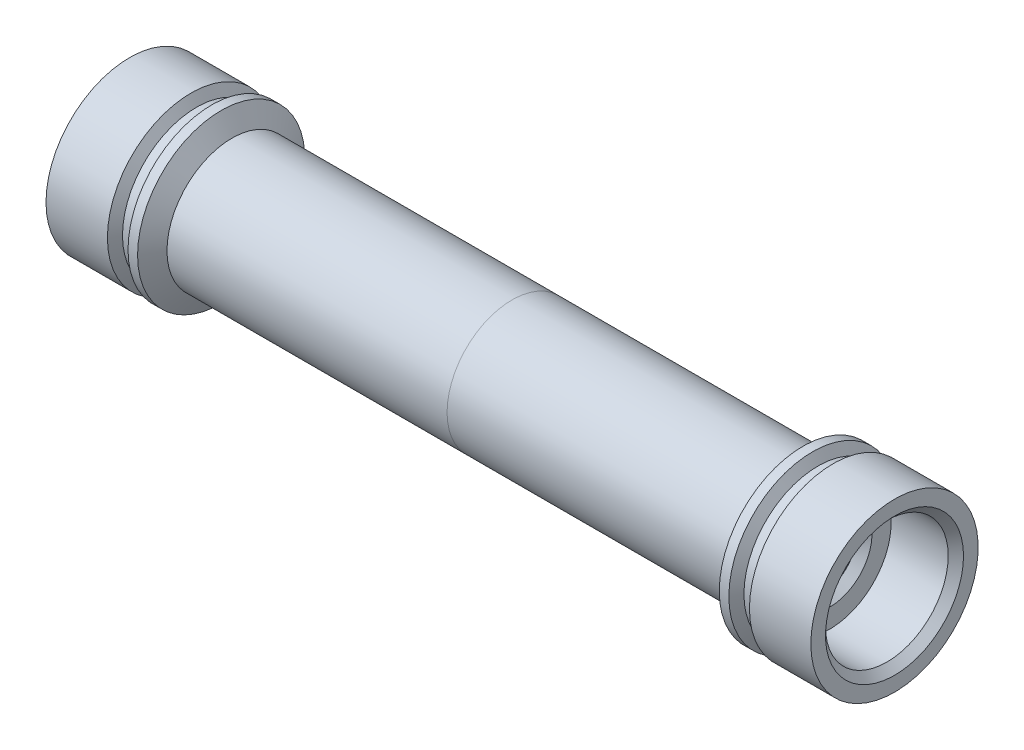
ISO-10303-21;
HEADER;
FILE_DESCRIPTION(('STEP AP214'),'2;1');
FILE_NAME('part.step','',(''),(''),'','','');
FILE_SCHEMA(('AUTOMOTIVE_DESIGN { 1 0 10303 214 1 1 1 1 }'));
ENDSEC;
DATA;
#1=APPLICATION_CONTEXT('core data for automotive mechanical design processes');
#2=APPLICATION_PROTOCOL_DEFINITION('international standard','automotive_design',2000,#1);
#3=PRODUCT_CONTEXT('',#1,'mechanical');
#4=PRODUCT('Part','Part','',(#3));
#5=PRODUCT_RELATED_PRODUCT_CATEGORY('part','',(#4));
#6=PRODUCT_DEFINITION_FORMATION('','',#4);
#7=PRODUCT_DEFINITION_CONTEXT('part definition',#1,'design');
#8=PRODUCT_DEFINITION('design','',#6,#7);
#9=PRODUCT_DEFINITION_SHAPE('','',#8);
#10=(LENGTH_UNIT() NAMED_UNIT(*) SI_UNIT(.MILLI.,.METRE.));
#11=(NAMED_UNIT(*) PLANE_ANGLE_UNIT() SI_UNIT($,.RADIAN.));
#12=(NAMED_UNIT(*) SI_UNIT($,.STERADIAN.) SOLID_ANGLE_UNIT());
#13=UNCERTAINTY_MEASURE_WITH_UNIT(LENGTH_MEASURE(1.E-05),#10,'distance_accuracy_value','');
#14=(GEOMETRIC_REPRESENTATION_CONTEXT(3) GLOBAL_UNCERTAINTY_ASSIGNED_CONTEXT((#13)) GLOBAL_UNIT_ASSIGNED_CONTEXT((#10,
#11,#12)) REPRESENTATION_CONTEXT('',''));
#15=CARTESIAN_POINT('',(0.,0.,0.));
#16=DIRECTION('',(0.,0.,1.));
#17=DIRECTION('',(1.,0.,0.));
#18=AXIS2_PLACEMENT_3D('',#15,#16,#17);
#19=CARTESIAN_POINT('',(19.3183825790646,0.,0.));
#20=DIRECTION('',(1.,0.,0.));
#21=DIRECTION('',(0.,0.,1.));
#22=AXIS2_PLACEMENT_3D('',#19,#20,#21);
#23=CONICAL_SURFACE('',#22,5.55625,1.0471975511966);
#24=CARTESIAN_POINT('',(18.6034786082405,0.,0.));
#25=DIRECTION('',(-1.,0.,0.));
#26=DIRECTION('',(0.,0.,1.));
#27=AXIS2_PLACEMENT_3D('',#24,#25,#26);
#28=CIRCLE('',#27,4.318);
#29=CARTESIAN_POINT('',(18.6034786082405,0.,4.318));
#30=VERTEX_POINT('',#29);
#31=EDGE_CURVE('E355',#30,#30,#28,.T.);
#32=ORIENTED_EDGE('',*,*,#31,.F.);
#33=EDGE_LOOP('',(#32));
#34=FACE_BOUND('',#33,.T.);
#35=CARTESIAN_POINT('',(19.3183825790646,0.,0.));
#36=DIRECTION('',(-1.,0.,0.));
#37=DIRECTION('',(0.,0.,1.));
#38=AXIS2_PLACEMENT_3D('',#35,#36,#37);
#39=CIRCLE('',#38,5.55625);
#40=CARTESIAN_POINT('',(19.3183825790646,0.,5.55625));
#41=VERTEX_POINT('',#40);
#42=EDGE_CURVE('E137',#41,#41,#39,.T.);
#43=ORIENTED_EDGE('',*,*,#42,.T.);
#44=EDGE_LOOP('',(#43));
#45=FACE_BOUND('',#44,.T.);
#46=ADVANCED_FACE('F65',(#34,#45),#23,.T.);
#47=CARTESIAN_POINT('',(25.4,0.,0.));
#48=DIRECTION('',(1.,0.,0.));
#49=DIRECTION('',(0.,0.,1.));
#50=AXIS2_PLACEMENT_3D('',#47,#48,#49);
#51=CYLINDRICAL_SURFACE('',#50,5.55625);
#52=ORIENTED_EDGE('',*,*,#42,.F.);
#53=EDGE_LOOP('',(#52));
#54=FACE_BOUND('',#53,.T.);
#55=CARTESIAN_POINT('',(19.9533825790646,0.,0.));
#56=DIRECTION('',(-1.,0.,0.));
#57=DIRECTION('',(0.,0.,1.));
#58=AXIS2_PLACEMENT_3D('',#55,#56,#57);
#59=CIRCLE('',#58,5.55625);
#60=CARTESIAN_POINT('',(19.9533825790646,0.,5.55625));
#61=VERTEX_POINT('',#60);
#62=EDGE_CURVE('E133',#61,#61,#59,.T.);
#63=ORIENTED_EDGE('',*,*,#62,.T.);
#64=EDGE_LOOP('',(#63));
#65=FACE_BOUND('',#64,.T.);
#66=ADVANCED_FACE('F164',(#54,#65),#51,.T.);
#67=CARTESIAN_POINT('',(20.32,0.,0.));
#68=DIRECTION('',(-1.,0.,0.));
#69=DIRECTION('',(0.,0.,-1.));
#70=AXIS2_PLACEMENT_3D('',#67,#68,#69);
#71=CONICAL_SURFACE('',#70,4.92125,1.0471975511966);
#72=ORIENTED_EDGE('',*,*,#62,.F.);
#73=EDGE_LOOP('',(#72));
#74=FACE_BOUND('',#73,.T.);
#75=CARTESIAN_POINT('',(20.32,0.,0.));
#76=DIRECTION('',(-1.,0.,0.));
#77=DIRECTION('',(0.,0.,1.));
#78=AXIS2_PLACEMENT_3D('',#75,#76,#77);
#79=CIRCLE('',#78,4.92125);
#80=CARTESIAN_POINT('',(20.32,0.,4.92125));
#81=VERTEX_POINT('',#80);
#82=EDGE_CURVE('E129',#81,#81,#79,.T.);
#83=ORIENTED_EDGE('',*,*,#82,.T.);
#84=EDGE_LOOP('',(#83));
#85=FACE_BOUND('',#84,.T.);
#86=ADVANCED_FACE('F168',(#74,#85),#71,.T.);
#87=CARTESIAN_POINT('',(25.4,0.,0.));
#88=DIRECTION('',(1.,0.,0.));
#89=DIRECTION('',(0.,0.,1.));
#90=AXIS2_PLACEMENT_3D('',#87,#88,#89);
#91=CYLINDRICAL_SURFACE('',#90,4.92125);
#92=ORIENTED_EDGE('',*,*,#82,.F.);
#93=EDGE_LOOP('',(#92));
#94=FACE_BOUND('',#93,.T.);
#95=CARTESIAN_POINT('',(20.955,0.,0.));
#96=DIRECTION('',(-1.,0.,0.));
#97=DIRECTION('',(0.,0.,1.));
#98=AXIS2_PLACEMENT_3D('',#95,#96,#97);
#99=CIRCLE('',#98,4.92125);
#100=CARTESIAN_POINT('',(20.955,0.,4.92125));
#101=VERTEX_POINT('',#100);
#102=EDGE_CURVE('E125',#101,#101,#99,.T.);
#103=ORIENTED_EDGE('',*,*,#102,.T.);
#104=EDGE_LOOP('',(#103));
#105=FACE_BOUND('',#104,.T.);
#106=ADVANCED_FACE('F176',(#94,#105),#91,.T.);
#107=CARTESIAN_POINT('',(21.3216174209354,0.,0.));
#108=DIRECTION('',(1.,0.,0.));
#109=DIRECTION('',(0.,0.,1.));
#110=AXIS2_PLACEMENT_3D('',#107,#108,#109);
#111=CONICAL_SURFACE('',#110,5.55625,1.0471975511966);
#112=ORIENTED_EDGE('',*,*,#102,.F.);
#113=EDGE_LOOP('',(#112));
#114=FACE_BOUND('',#113,.T.);
#115=CARTESIAN_POINT('',(21.3216174209354,0.,0.));
#116=DIRECTION('',(-1.,0.,0.));
#117=DIRECTION('',(0.,0.,1.));
#118=AXIS2_PLACEMENT_3D('',#115,#116,#117);
#119=CIRCLE('',#118,5.55625);
#120=CARTESIAN_POINT('',(21.3216174209354,0.,5.55625));
#121=VERTEX_POINT('',#120);
#122=EDGE_CURVE('E121',#121,#121,#119,.T.);
#123=ORIENTED_EDGE('',*,*,#122,.T.);
#124=EDGE_LOOP('',(#123));
#125=FACE_BOUND('',#124,.T.);
#126=ADVANCED_FACE('F180',(#114,#125),#111,.T.);
#127=CARTESIAN_POINT('',(25.4,0.,0.));
#128=DIRECTION('',(1.,0.,0.));
#129=DIRECTION('',(0.,0.,1.));
#130=AXIS2_PLACEMENT_3D('',#127,#128,#129);
#131=CYLINDRICAL_SURFACE('',#130,5.55625);
#132=ORIENTED_EDGE('',*,*,#122,.F.);
#133=EDGE_LOOP('',(#132));
#134=FACE_BOUND('',#133,.T.);
#135=CARTESIAN_POINT('',(25.4,0.,0.));
#136=DIRECTION('',(-1.,0.,0.));
#137=DIRECTION('',(0.,0.,1.));
#138=AXIS2_PLACEMENT_3D('',#135,#136,#137);
#139=CIRCLE('',#138,5.55625);
#140=CARTESIAN_POINT('',(25.4,0.,5.55625));
#141=VERTEX_POINT('',#140);
#142=EDGE_CURVE('E118',#141,#141,#139,.T.);
#143=ORIENTED_EDGE('',*,*,#142,.T.);
#144=EDGE_LOOP('',(#143));
#145=FACE_BOUND('',#144,.T.);
#146=ADVANCED_FACE('F184',(#134,#145),#131,.T.);
#147=CARTESIAN_POINT('',(25.4,0.,0.));
#148=DIRECTION('',(-1.,0.,0.));
#149=DIRECTION('',(0.,0.,-1.));
#150=AXIS2_PLACEMENT_3D('',#147,#148,#149);
#151=PLANE('',#150);
#152=CARTESIAN_POINT('',(25.4,0.,0.));
#153=DIRECTION('',(1.,0.,0.));
#154=DIRECTION('',(0.,0.,-1.));
#155=AXIS2_PLACEMENT_3D('',#152,#153,#154);
#156=CIRCLE('',#155,4.583);
#157=CARTESIAN_POINT('',(25.4,0.,-4.583));
#158=VERTEX_POINT('',#157);
#159=EDGE_CURVE('E12',#158,#158,#156,.T.);
#160=ORIENTED_EDGE('',*,*,#159,.F.);
#161=EDGE_LOOP('',(#160));
#162=FACE_BOUND('',#161,.T.);
#163=ORIENTED_EDGE('',*,*,#142,.F.);
#164=EDGE_LOOP('',(#163));
#165=FACE_BOUND('',#164,.T.);
#166=ADVANCED_FACE('F150',(#162,#165),#151,.F.);
#167=CARTESIAN_POINT('',(25.4,0.,0.));
#168=DIRECTION('',(1.,0.,0.));
#169=DIRECTION('',(0.,0.,1.));
#170=AXIS2_PLACEMENT_3D('',#167,#168,#169);
#171=CYLINDRICAL_SURFACE('',#170,4.075);
#172=CARTESIAN_POINT('',(24.892,0.,0.));
#173=DIRECTION('',(1.,0.,0.));
#174=DIRECTION('',(0.,0.,-1.));
#175=AXIS2_PLACEMENT_3D('',#172,#173,#174);
#176=CIRCLE('',#175,4.075);
#177=CARTESIAN_POINT('',(24.892,0.,-4.075));
#178=VERTEX_POINT('',#177);
#179=EDGE_CURVE('E73',#178,#178,#176,.F.);
#180=ORIENTED_EDGE('',*,*,#179,.F.);
#181=EDGE_LOOP('',(#180));
#182=FACE_BOUND('',#181,.T.);
#183=CARTESIAN_POINT('',(21.099999964,0.,0.));
#184=DIRECTION('',(-1.,0.,0.));
#185=DIRECTION('',(0.,0.,1.));
#186=AXIS2_PLACEMENT_3D('',#183,#184,#185);
#187=CIRCLE('',#186,4.075);
#188=CARTESIAN_POINT('',(21.099999964,0.,4.075));
#189=VERTEX_POINT('',#188);
#190=EDGE_CURVE('E114',#189,#189,#187,.T.);
#191=ORIENTED_EDGE('',*,*,#190,.T.);
#192=EDGE_LOOP('',(#191));
#193=FACE_BOUND('',#192,.T.);
#194=ADVANCED_FACE('F146',(#182,#193),#171,.F.);
#195=CARTESIAN_POINT('',(21.099999964,0.,0.));
#196=DIRECTION('',(-1.,0.,0.));
#197=DIRECTION('',(0.,0.,-1.));
#198=AXIS2_PLACEMENT_3D('',#195,#196,#197);
#199=PLANE('',#198);
#200=CARTESIAN_POINT('',(21.099999964,0.,0.));
#201=DIRECTION('',(-1.,0.,0.));
#202=DIRECTION('',(0.,0.,1.));
#203=AXIS2_PLACEMENT_3D('',#200,#201,#202);
#204=CIRCLE('',#203,2.805);
#205=CARTESIAN_POINT('',(21.099999964,0.,2.805));
#206=VERTEX_POINT('',#205);
#207=EDGE_CURVE('E110',#206,#206,#204,.T.);
#208=ORIENTED_EDGE('',*,*,#207,.T.);
#209=EDGE_LOOP('',(#208));
#210=FACE_BOUND('',#209,.T.);
#211=ORIENTED_EDGE('',*,*,#190,.F.);
#212=EDGE_LOOP('',(#211));
#213=FACE_BOUND('',#212,.T.);
#214=ADVANCED_FACE('F149',(#210,#213),#199,.F.);
#215=CARTESIAN_POINT('',(21.099999964,0.,0.));
#216=DIRECTION('',(1.,0.,0.));
#217=DIRECTION('',(0.,0.,1.));
#218=AXIS2_PLACEMENT_3D('',#215,#216,#217);
#219=CONICAL_SURFACE('',#218,2.805,0.785398163397449);
#220=CARTESIAN_POINT('',(20.591999964,0.,0.));
#221=DIRECTION('',(-1.,0.,0.));
#222=DIRECTION('',(0.,0.,1.));
#223=AXIS2_PLACEMENT_3D('',#220,#221,#222);
#224=CIRCLE('',#223,2.297);
#225=CARTESIAN_POINT('',(20.591999964,0.,2.297));
#226=VERTEX_POINT('',#225);
#227=EDGE_CURVE('E106',#226,#226,#224,.T.);
#228=ORIENTED_EDGE('',*,*,#227,.T.);
#229=EDGE_LOOP('',(#228));
#230=FACE_BOUND('',#229,.T.);
#231=ORIENTED_EDGE('',*,*,#207,.F.);
#232=EDGE_LOOP('',(#231));
#233=FACE_BOUND('',#232,.T.);
#234=ADVANCED_FACE('F155',(#230,#233),#219,.F.);
#235=CARTESIAN_POINT('',(20.591999964,0.,0.));
#236=DIRECTION('',(-1.,0.,0.));
#237=DIRECTION('',(0.,0.,-1.));
#238=AXIS2_PLACEMENT_3D('',#235,#236,#237);
#239=PLANE('',#238);
#240=CARTESIAN_POINT('',(20.591999964,0.,0.));
#241=DIRECTION('',(-1.,0.,0.));
#242=DIRECTION('',(0.,0.,1.));
#243=AXIS2_PLACEMENT_3D('',#240,#241,#242);
#244=CIRCLE('',#243,1.905);
#245=CARTESIAN_POINT('',(20.591999964,0.,1.905));
#246=VERTEX_POINT('',#245);
#247=EDGE_CURVE('E95',#246,#246,#244,.T.);
#248=ORIENTED_EDGE('',*,*,#247,.T.);
#249=EDGE_LOOP('',(#248));
#250=FACE_BOUND('',#249,.T.);
#251=ORIENTED_EDGE('',*,*,#227,.F.);
#252=EDGE_LOOP('',(#251));
#253=FACE_BOUND('',#252,.T.);
#254=ADVANCED_FACE('F160',(#250,#253),#239,.F.);
#255=CARTESIAN_POINT('',(25.4,0.,0.));
#256=DIRECTION('',(1.,0.,0.));
#257=DIRECTION('',(0.,0.,1.));
#258=AXIS2_PLACEMENT_3D('',#255,#256,#257);
#259=CYLINDRICAL_SURFACE('',#258,1.905);
#260=CARTESIAN_POINT('',(15.448,0.,0.));
#261=DIRECTION('',(-1.,0.,0.));
#262=DIRECTION('',(0.,0.,1.));
#263=AXIS2_PLACEMENT_3D('',#260,#261,#262);
#264=CIRCLE('',#263,1.905);
#265=CARTESIAN_POINT('',(15.448,0.,1.905));
#266=VERTEX_POINT('',#265);
#267=EDGE_CURVE('E87',#266,#266,#264,.T.);
#268=ORIENTED_EDGE('',*,*,#267,.T.);
#269=EDGE_LOOP('',(#268));
#270=FACE_BOUND('',#269,.T.);
#271=ORIENTED_EDGE('',*,*,#247,.F.);
#272=EDGE_LOOP('',(#271));
#273=FACE_BOUND('',#272,.T.);
#274=ADVANCED_FACE('F215',(#270,#273),#259,.F.);
#275=CARTESIAN_POINT('',(15.448,0.,0.));
#276=DIRECTION('',(-1.,0.,0.));
#277=DIRECTION('',(0.,0.,-1.));
#278=AXIS2_PLACEMENT_3D('',#275,#276,#277);
#279=PLANE('',#278);
#280=ORIENTED_EDGE('',*,*,#267,.F.);
#281=EDGE_LOOP('',(#280));
#282=FACE_BOUND('',#281,.T.);
#283=ADVANCED_FACE('F80',(#282),#279,.F.);
#284=CARTESIAN_POINT('',(12.5,0.,0.));
#285=DIRECTION('',(-1.,0.,0.));
#286=DIRECTION('',(0.,0.,-1.));
#287=AXIS2_PLACEMENT_3D('',#284,#285,#286);
#288=CONICAL_SURFACE('',#287,1.625000052,0.785398163397449);
#289=CARTESIAN_POINT('',(14.125000052,0.,0.));
#290=VERTEX_POINT('',#289);
#291=VERTEX_LOOP('',#290);
#292=FACE_BOUND('',#291,.T.);
#293=CARTESIAN_POINT('',(12.5,0.,0.));
#294=DIRECTION('',(-1.,0.,0.));
#295=DIRECTION('',(0.,0.,1.));
#296=AXIS2_PLACEMENT_3D('',#293,#294,#295);
#297=CIRCLE('',#296,1.625000052);
#298=CARTESIAN_POINT('',(12.5,0.,1.625000052));
#299=VERTEX_POINT('',#298);
#300=EDGE_CURVE('E84',#299,#299,#297,.T.);
#301=ORIENTED_EDGE('',*,*,#300,.T.);
#302=EDGE_LOOP('',(#301));
#303=FACE_BOUND('',#302,.T.);
#304=ADVANCED_FACE('F76',(#292,#303),#288,.F.);
#305=CARTESIAN_POINT('',(25.4,0.,0.));
#306=DIRECTION('',(1.,0.,0.));
#307=DIRECTION('',(0.,0.,1.));
#308=AXIS2_PLACEMENT_3D('',#305,#306,#307);
#309=CYLINDRICAL_SURFACE('',#308,1.625000052);
#310=ORIENTED_EDGE('',*,*,#300,.F.);
#311=EDGE_LOOP('',(#310));
#312=FACE_BOUND('',#311,.T.);
#313=CARTESIAN_POINT('',(0.,0.,0.));
#314=DIRECTION('',(-1.,0.,0.));
#315=DIRECTION('',(0.,0.,1.));
#316=AXIS2_PLACEMENT_3D('',#313,#314,#315);
#317=CIRCLE('',#316,1.625000052);
#318=CARTESIAN_POINT('',(0.,0.,1.625000052));
#319=VERTEX_POINT('',#318);
#320=EDGE_CURVE('E88',#319,#319,#317,.T.);
#321=ORIENTED_EDGE('',*,*,#320,.T.);
#322=EDGE_LOOP('',(#321));
#323=FACE_BOUND('',#322,.T.);
#324=ADVANCED_FACE('F79',(#312,#323),#309,.F.);
#325=CARTESIAN_POINT('',(0.,0.,0.));
#326=DIRECTION('',(1.,0.,0.));
#327=DIRECTION('',(0.,0.,1.));
#328=AXIS2_PLACEMENT_3D('',#325,#326,#327);
#329=PLANE('',#328);
#330=CARTESIAN_POINT('',(0.,0.,0.));
#331=DIRECTION('',(-1.,0.,0.));
#332=DIRECTION('',(0.,0.,1.));
#333=AXIS2_PLACEMENT_3D('',#330,#331,#332);
#334=CIRCLE('',#333,4.318);
#335=CARTESIAN_POINT('',(0.,0.,4.318));
#336=VERTEX_POINT('',#335);
#337=EDGE_CURVE('E99',#336,#336,#334,.T.);
#338=ORIENTED_EDGE('',*,*,#337,.T.);
#339=EDGE_LOOP('',(#338));
#340=FACE_BOUND('',#339,.T.);
#341=ORIENTED_EDGE('',*,*,#320,.F.);
#342=EDGE_LOOP('',(#341));
#343=FACE_BOUND('',#342,.T.);
#344=ADVANCED_FACE('F201',(#340,#343),#329,.F.);
#345=CARTESIAN_POINT('',(25.4,0.,0.));
#346=DIRECTION('',(1.,0.,0.));
#347=DIRECTION('',(0.,0.,1.));
#348=AXIS2_PLACEMENT_3D('',#345,#346,#347);
#349=CYLINDRICAL_SURFACE('',#348,4.318);
#350=ORIENTED_EDGE('',*,*,#337,.F.);
#351=EDGE_LOOP('',(#350));
#352=FACE_BOUND('',#351,.T.);
#353=ORIENTED_EDGE('',*,*,#31,.T.);
#354=EDGE_LOOP('',(#353));
#355=FACE_BOUND('',#354,.T.);
#356=ADVANCED_FACE('F198',(#352,#355),#349,.T.);
#357=CARTESIAN_POINT('',(24.892,0.,0.));
#358=DIRECTION('',(1.,0.,0.));
#359=DIRECTION('',(0.,0.,1.));
#360=AXIS2_PLACEMENT_3D('',#357,#358,#359);
#361=CONICAL_SURFACE('',#360,4.075,0.785398163397457);
#362=ORIENTED_EDGE('',*,*,#159,.T.);
#363=EDGE_LOOP('',(#362));
#364=FACE_BOUND('',#363,.T.);
#365=ORIENTED_EDGE('',*,*,#179,.T.);
#366=EDGE_LOOP('',(#365));
#367=FACE_BOUND('',#366,.T.);
#368=ADVANCED_FACE('F67',(#364,#367),#361,.F.);
#369=CLOSED_SHELL('',(#46,#66,#86,#106,#126,#146,#166,#194,#214,#234,#254,#274,#283,#304,#324,
#344,#356,#368));
#370=MANIFOLD_SOLID_BREP('B2',#369);
#371=CARTESIAN_POINT('',(-19.3183825790646,0.,0.));
#372=DIRECTION('',(-1.,0.,0.));
#373=DIRECTION('',(0.,0.,1.));
#374=AXIS2_PLACEMENT_3D('',#371,#372,#373);
#375=CONICAL_SURFACE('',#374,5.55625,1.0471975511966);
#376=CARTESIAN_POINT('',(-18.6034786082405,0.,0.));
#377=DIRECTION('',(-1.,0.,0.));
#378=DIRECTION('',(0.,0.,1.));
#379=AXIS2_PLACEMENT_3D('',#376,#377,#378);
#380=CIRCLE('',#379,4.318);
#381=CARTESIAN_POINT('',(-18.6034786082405,0.,4.318));
#382=VERTEX_POINT('',#381);
#383=EDGE_CURVE('E537',#382,#382,#380,.T.);
#384=ORIENTED_EDGE('',*,*,#383,.T.);
#385=EDGE_LOOP('',(#384));
#386=FACE_BOUND('',#385,.T.);
#387=CARTESIAN_POINT('',(-19.3183825790646,0.,0.));
#388=DIRECTION('',(-1.,0.,0.));
#389=DIRECTION('',(0.,0.,1.));
#390=AXIS2_PLACEMENT_3D('',#387,#388,#389);
#391=CIRCLE('',#390,5.55625);
#392=CARTESIAN_POINT('',(-19.3183825790646,0.,5.55625));
#393=VERTEX_POINT('',#392);
#394=EDGE_CURVE('E457',#393,#393,#391,.T.);
#395=ORIENTED_EDGE('',*,*,#394,.F.);
#396=EDGE_LOOP('',(#395));
#397=FACE_BOUND('',#396,.T.);
#398=ADVANCED_FACE('F385',(#386,#397),#375,.T.);
#399=CARTESIAN_POINT('',(-25.4,0.,0.));
#400=DIRECTION('',(-1.,0.,0.));
#401=DIRECTION('',(0.,0.,1.));
#402=AXIS2_PLACEMENT_3D('',#399,#400,#401);
#403=CYLINDRICAL_SURFACE('',#402,5.55625);
#404=ORIENTED_EDGE('',*,*,#394,.T.);
#405=EDGE_LOOP('',(#404));
#406=FACE_BOUND('',#405,.T.);
#407=CARTESIAN_POINT('',(-19.9533825790646,0.,0.));
#408=DIRECTION('',(-1.,0.,0.));
#409=DIRECTION('',(0.,0.,1.));
#410=AXIS2_PLACEMENT_3D('',#407,#408,#409);
#411=CIRCLE('',#410,5.55625);
#412=CARTESIAN_POINT('',(-19.9533825790646,0.,5.55625));
#413=VERTEX_POINT('',#412);
#414=EDGE_CURVE('E453',#413,#413,#411,.T.);
#415=ORIENTED_EDGE('',*,*,#414,.F.);
#416=EDGE_LOOP('',(#415));
#417=FACE_BOUND('',#416,.T.);
#418=ADVANCED_FACE('F477',(#406,#417),#403,.T.);
#419=CARTESIAN_POINT('',(-20.32,0.,0.));
#420=DIRECTION('',(1.,0.,0.));
#421=DIRECTION('',(0.,0.,-1.));
#422=AXIS2_PLACEMENT_3D('',#419,#420,#421);
#423=CONICAL_SURFACE('',#422,4.92125,1.0471975511966);
#424=ORIENTED_EDGE('',*,*,#414,.T.);
#425=EDGE_LOOP('',(#424));
#426=FACE_BOUND('',#425,.T.);
#427=CARTESIAN_POINT('',(-20.32,0.,0.));
#428=DIRECTION('',(-1.,0.,0.));
#429=DIRECTION('',(0.,0.,1.));
#430=AXIS2_PLACEMENT_3D('',#427,#428,#429);
#431=CIRCLE('',#430,4.92125);
#432=CARTESIAN_POINT('',(-20.32,0.,4.92125));
#433=VERTEX_POINT('',#432);
#434=EDGE_CURVE('E449',#433,#433,#431,.T.);
#435=ORIENTED_EDGE('',*,*,#434,.F.);
#436=EDGE_LOOP('',(#435));
#437=FACE_BOUND('',#436,.T.);
#438=ADVANCED_FACE('F481',(#426,#437),#423,.T.);
#439=CARTESIAN_POINT('',(-25.4,0.,0.));
#440=DIRECTION('',(-1.,0.,0.));
#441=DIRECTION('',(0.,0.,1.));
#442=AXIS2_PLACEMENT_3D('',#439,#440,#441);
#443=CYLINDRICAL_SURFACE('',#442,4.92125);
#444=ORIENTED_EDGE('',*,*,#434,.T.);
#445=EDGE_LOOP('',(#444));
#446=FACE_BOUND('',#445,.T.);
#447=CARTESIAN_POINT('',(-20.955,0.,0.));
#448=DIRECTION('',(-1.,0.,0.));
#449=DIRECTION('',(0.,0.,1.));
#450=AXIS2_PLACEMENT_3D('',#447,#448,#449);
#451=CIRCLE('',#450,4.92125);
#452=CARTESIAN_POINT('',(-20.955,0.,4.92125));
#453=VERTEX_POINT('',#452);
#454=EDGE_CURVE('E445',#453,#453,#451,.T.);
#455=ORIENTED_EDGE('',*,*,#454,.F.);
#456=EDGE_LOOP('',(#455));
#457=FACE_BOUND('',#456,.T.);
#458=ADVANCED_FACE('F489',(#446,#457),#443,.T.);
#459=CARTESIAN_POINT('',(-21.3216174209354,0.,0.));
#460=DIRECTION('',(-1.,0.,0.));
#461=DIRECTION('',(0.,0.,1.));
#462=AXIS2_PLACEMENT_3D('',#459,#460,#461);
#463=CONICAL_SURFACE('',#462,5.55625,1.0471975511966);
#464=ORIENTED_EDGE('',*,*,#454,.T.);
#465=EDGE_LOOP('',(#464));
#466=FACE_BOUND('',#465,.T.);
#467=CARTESIAN_POINT('',(-21.3216174209354,0.,0.));
#468=DIRECTION('',(-1.,0.,0.));
#469=DIRECTION('',(0.,0.,1.));
#470=AXIS2_PLACEMENT_3D('',#467,#468,#469);
#471=CIRCLE('',#470,5.55625);
#472=CARTESIAN_POINT('',(-21.3216174209354,0.,5.55625));
#473=VERTEX_POINT('',#472);
#474=EDGE_CURVE('E441',#473,#473,#471,.T.);
#475=ORIENTED_EDGE('',*,*,#474,.F.);
#476=EDGE_LOOP('',(#475));
#477=FACE_BOUND('',#476,.T.);
#478=ADVANCED_FACE('F493',(#466,#477),#463,.T.);
#479=CARTESIAN_POINT('',(-25.4,0.,0.));
#480=DIRECTION('',(-1.,0.,0.));
#481=DIRECTION('',(0.,0.,1.));
#482=AXIS2_PLACEMENT_3D('',#479,#480,#481);
#483=CYLINDRICAL_SURFACE('',#482,5.55625);
#484=ORIENTED_EDGE('',*,*,#474,.T.);
#485=EDGE_LOOP('',(#484));
#486=FACE_BOUND('',#485,.T.);
#487=CARTESIAN_POINT('',(-25.4,0.,0.));
#488=DIRECTION('',(-1.,0.,0.));
#489=DIRECTION('',(0.,0.,1.));
#490=AXIS2_PLACEMENT_3D('',#487,#488,#489);
#491=CIRCLE('',#490,5.55625);
#492=CARTESIAN_POINT('',(-25.4,0.,5.55625));
#493=VERTEX_POINT('',#492);
#494=EDGE_CURVE('E437',#493,#493,#491,.T.);
#495=ORIENTED_EDGE('',*,*,#494,.F.);
#496=EDGE_LOOP('',(#495));
#497=FACE_BOUND('',#496,.T.);
#498=ADVANCED_FACE('F497',(#486,#497),#483,.T.);
#499=CARTESIAN_POINT('',(-25.4,0.,0.));
#500=DIRECTION('',(1.,0.,0.));
#501=DIRECTION('',(0.,0.,-1.));
#502=AXIS2_PLACEMENT_3D('',#499,#500,#501);
#503=PLANE('',#502);
#504=CARTESIAN_POINT('',(-25.4,0.,0.));
#505=DIRECTION('',(1.,0.,0.));
#506=DIRECTION('',(0.,0.,-1.));
#507=AXIS2_PLACEMENT_3D('',#504,#505,#506);
#508=CIRCLE('',#507,4.583);
#509=CARTESIAN_POINT('',(-25.4,0.,-4.583));
#510=VERTEX_POINT('',#509);
#511=EDGE_CURVE('E63',#510,#510,#508,.T.);
#512=ORIENTED_EDGE('',*,*,#511,.T.);
#513=EDGE_LOOP('',(#512));
#514=FACE_BOUND('',#513,.T.);
#515=ORIENTED_EDGE('',*,*,#494,.T.);
#516=EDGE_LOOP('',(#515));
#517=FACE_BOUND('',#516,.T.);
#518=ADVANCED_FACE('F501',(#514,#517),#503,.F.);
#519=CARTESIAN_POINT('',(-25.4,0.,0.));
#520=DIRECTION('',(-1.,0.,0.));
#521=DIRECTION('',(0.,0.,1.));
#522=AXIS2_PLACEMENT_3D('',#519,#520,#521);
#523=CYLINDRICAL_SURFACE('',#522,4.075);
#524=CARTESIAN_POINT('',(-24.892,0.,0.));
#525=DIRECTION('',(1.,0.,0.));
#526=DIRECTION('',(0.,0.,-1.));
#527=AXIS2_PLACEMENT_3D('',#524,#525,#526);
#528=CIRCLE('',#527,4.075);
#529=CARTESIAN_POINT('',(-24.892,0.,-4.075));
#530=VERTEX_POINT('',#529);
#531=EDGE_CURVE('E394',#530,#530,#528,.F.);
#532=ORIENTED_EDGE('',*,*,#531,.T.);
#533=EDGE_LOOP('',(#532));
#534=FACE_BOUND('',#533,.T.);
#535=CARTESIAN_POINT('',(-21.099999964,0.,0.));
#536=DIRECTION('',(-1.,0.,0.));
#537=DIRECTION('',(0.,0.,1.));
#538=AXIS2_PLACEMENT_3D('',#535,#536,#537);
#539=CIRCLE('',#538,4.075);
#540=CARTESIAN_POINT('',(-21.099999964,0.,4.075));
#541=VERTEX_POINT('',#540);
#542=EDGE_CURVE('E433',#541,#541,#539,.T.);
#543=ORIENTED_EDGE('',*,*,#542,.F.);
#544=EDGE_LOOP('',(#543));
#545=FACE_BOUND('',#544,.T.);
#546=ADVANCED_FACE('F464',(#534,#545),#523,.F.);
#547=CARTESIAN_POINT('',(-21.099999964,0.,0.));
#548=DIRECTION('',(1.,0.,0.));
#549=DIRECTION('',(0.,0.,-1.));
#550=AXIS2_PLACEMENT_3D('',#547,#548,#549);
#551=PLANE('',#550);
#552=CARTESIAN_POINT('',(-21.099999964,0.,0.));
#553=DIRECTION('',(-1.,0.,0.));
#554=DIRECTION('',(0.,0.,1.));
#555=AXIS2_PLACEMENT_3D('',#552,#553,#554);
#556=CIRCLE('',#555,2.805);
#557=CARTESIAN_POINT('',(-21.099999964,0.,2.805));
#558=VERTEX_POINT('',#557);
#559=EDGE_CURVE('E430',#558,#558,#556,.T.);
#560=ORIENTED_EDGE('',*,*,#559,.F.);
#561=EDGE_LOOP('',(#560));
#562=FACE_BOUND('',#561,.T.);
#563=ORIENTED_EDGE('',*,*,#542,.T.);
#564=EDGE_LOOP('',(#563));
#565=FACE_BOUND('',#564,.T.);
#566=ADVANCED_FACE('F508',(#562,#565),#551,.F.);
#567=CARTESIAN_POINT('',(-21.099999964,0.,0.));
#568=DIRECTION('',(-1.,0.,0.));
#569=DIRECTION('',(0.,0.,1.));
#570=AXIS2_PLACEMENT_3D('',#567,#568,#569);
#571=CONICAL_SURFACE('',#570,2.805,0.785398163397449);
#572=CARTESIAN_POINT('',(-20.591999964,0.,0.));
#573=DIRECTION('',(-1.,0.,0.));
#574=DIRECTION('',(0.,0.,1.));
#575=AXIS2_PLACEMENT_3D('',#572,#573,#574);
#576=CIRCLE('',#575,2.297);
#577=CARTESIAN_POINT('',(-20.591999964,0.,2.297));
#578=VERTEX_POINT('',#577);
#579=EDGE_CURVE('E426',#578,#578,#576,.T.);
#580=ORIENTED_EDGE('',*,*,#579,.F.);
#581=EDGE_LOOP('',(#580));
#582=FACE_BOUND('',#581,.T.);
#583=ORIENTED_EDGE('',*,*,#559,.T.);
#584=EDGE_LOOP('',(#583));
#585=FACE_BOUND('',#584,.T.);
#586=ADVANCED_FACE('F511',(#582,#585),#571,.F.);
#587=CARTESIAN_POINT('',(-20.591999964,0.,0.));
#588=DIRECTION('',(1.,0.,0.));
#589=DIRECTION('',(0.,0.,-1.));
#590=AXIS2_PLACEMENT_3D('',#587,#588,#589);
#591=PLANE('',#590);
#592=CARTESIAN_POINT('',(-20.591999964,0.,0.));
#593=DIRECTION('',(-1.,0.,0.));
#594=DIRECTION('',(0.,0.,1.));
#595=AXIS2_PLACEMENT_3D('',#592,#593,#594);
#596=CIRCLE('',#595,1.905);
#597=CARTESIAN_POINT('',(-20.591999964,0.,1.905));
#598=VERTEX_POINT('',#597);
#599=EDGE_CURVE('E415',#598,#598,#596,.T.);
#600=ORIENTED_EDGE('',*,*,#599,.F.);
#601=EDGE_LOOP('',(#600));
#602=FACE_BOUND('',#601,.T.);
#603=ORIENTED_EDGE('',*,*,#579,.T.);
#604=EDGE_LOOP('',(#603));
#605=FACE_BOUND('',#604,.T.);
#606=ADVANCED_FACE('F515',(#602,#605),#591,.F.);
#607=CARTESIAN_POINT('',(-25.4,0.,0.));
#608=DIRECTION('',(-1.,0.,0.));
#609=DIRECTION('',(0.,0.,1.));
#610=AXIS2_PLACEMENT_3D('',#607,#608,#609);
#611=CYLINDRICAL_SURFACE('',#610,1.905);
#612=CARTESIAN_POINT('',(-15.448,0.,0.));
#613=DIRECTION('',(-1.,0.,0.));
#614=DIRECTION('',(0.,0.,1.));
#615=AXIS2_PLACEMENT_3D('',#612,#613,#614);
#616=CIRCLE('',#615,1.905);
#617=CARTESIAN_POINT('',(-15.448,0.,1.905));
#618=VERTEX_POINT('',#617);
#619=EDGE_CURVE('E408',#618,#618,#616,.T.);
#620=ORIENTED_EDGE('',*,*,#619,.F.);
#621=EDGE_LOOP('',(#620));
#622=FACE_BOUND('',#621,.T.);
#623=ORIENTED_EDGE('',*,*,#599,.T.);
#624=EDGE_LOOP('',(#623));
#625=FACE_BOUND('',#624,.T.);
#626=ADVANCED_FACE('F519',(#622,#625),#611,.F.);
#627=CARTESIAN_POINT('',(-15.448,0.,0.));
#628=DIRECTION('',(1.,0.,0.));
#629=DIRECTION('',(0.,0.,-1.));
#630=AXIS2_PLACEMENT_3D('',#627,#628,#629);
#631=PLANE('',#630);
#632=ORIENTED_EDGE('',*,*,#619,.T.);
#633=EDGE_LOOP('',(#632));
#634=FACE_BOUND('',#633,.T.);
#635=ADVANCED_FACE('F401',(#634),#631,.F.);
#636=CARTESIAN_POINT('',(-12.5,0.,0.));
#637=DIRECTION('',(1.,0.,0.));
#638=DIRECTION('',(0.,0.,-1.));
#639=AXIS2_PLACEMENT_3D('',#636,#637,#638);
#640=CONICAL_SURFACE('',#639,1.625000052,0.785398163397449);
#641=CARTESIAN_POINT('',(-14.125000052,0.,0.));
#642=VERTEX_POINT('',#641);
#643=VERTEX_LOOP('',#642);
#644=FACE_BOUND('',#643,.T.);
#645=CARTESIAN_POINT('',(-12.5,0.,0.));
#646=DIRECTION('',(-1.,0.,0.));
#647=DIRECTION('',(0.,0.,1.));
#648=AXIS2_PLACEMENT_3D('',#645,#646,#647);
#649=CIRCLE('',#648,1.625000052);
#650=CARTESIAN_POINT('',(-12.5,0.,1.625000052));
#651=VERTEX_POINT('',#650);
#652=EDGE_CURVE('E405',#651,#651,#649,.T.);
#653=ORIENTED_EDGE('',*,*,#652,.F.);
#654=EDGE_LOOP('',(#653));
#655=FACE_BOUND('',#654,.T.);
#656=ADVANCED_FACE('F397',(#644,#655),#640,.F.);
#657=CARTESIAN_POINT('',(-25.4,0.,0.));
#658=DIRECTION('',(-1.,0.,0.));
#659=DIRECTION('',(0.,0.,1.));
#660=AXIS2_PLACEMENT_3D('',#657,#658,#659);
#661=CYLINDRICAL_SURFACE('',#660,1.625000052);
#662=ORIENTED_EDGE('',*,*,#652,.T.);
#663=EDGE_LOOP('',(#662));
#664=FACE_BOUND('',#663,.T.);
#665=CARTESIAN_POINT('',(0.,0.,0.));
#666=DIRECTION('',(-1.,0.,0.));
#667=DIRECTION('',(0.,0.,1.));
#668=AXIS2_PLACEMENT_3D('',#665,#666,#667);
#669=CIRCLE('',#668,1.625000052);
#670=CARTESIAN_POINT('',(0.,0.,1.625000052));
#671=VERTEX_POINT('',#670);
#672=EDGE_CURVE('E409',#671,#671,#669,.T.);
#673=ORIENTED_EDGE('',*,*,#672,.F.);
#674=EDGE_LOOP('',(#673));
#675=FACE_BOUND('',#674,.T.);
#676=ADVANCED_FACE('F400',(#664,#675),#661,.F.);
#677=CARTESIAN_POINT('',(0.,0.,0.));
#678=DIRECTION('',(-1.,0.,0.));
#679=DIRECTION('',(0.,0.,1.));
#680=AXIS2_PLACEMENT_3D('',#677,#678,#679);
#681=PLANE('',#680);
#682=CARTESIAN_POINT('',(0.,0.,0.));
#683=DIRECTION('',(-1.,0.,0.));
#684=DIRECTION('',(0.,0.,1.));
#685=AXIS2_PLACEMENT_3D('',#682,#683,#684);
#686=CIRCLE('',#685,4.318);
#687=CARTESIAN_POINT('',(0.,0.,4.318));
#688=VERTEX_POINT('',#687);
#689=EDGE_CURVE('E419',#688,#688,#686,.T.);
#690=ORIENTED_EDGE('',*,*,#689,.F.);
#691=EDGE_LOOP('',(#690));
#692=FACE_BOUND('',#691,.T.);
#693=ORIENTED_EDGE('',*,*,#672,.T.);
#694=EDGE_LOOP('',(#693));
#695=FACE_BOUND('',#694,.T.);
#696=ADVANCED_FACE('F472',(#692,#695),#681,.F.);
#697=CARTESIAN_POINT('',(-25.4,0.,0.));
#698=DIRECTION('',(-1.,0.,0.));
#699=DIRECTION('',(0.,0.,1.));
#700=AXIS2_PLACEMENT_3D('',#697,#698,#699);
#701=CYLINDRICAL_SURFACE('',#700,4.318);
#702=ORIENTED_EDGE('',*,*,#689,.T.);
#703=EDGE_LOOP('',(#702));
#704=FACE_BOUND('',#703,.T.);
#705=ORIENTED_EDGE('',*,*,#383,.F.);
#706=EDGE_LOOP('',(#705));
#707=FACE_BOUND('',#706,.T.);
#708=ADVANCED_FACE('F468',(#704,#707),#701,.T.);
#709=CARTESIAN_POINT('',(-24.892,0.,0.));
#710=DIRECTION('',(-1.,0.,0.));
#711=DIRECTION('',(0.,0.,1.));
#712=AXIS2_PLACEMENT_3D('',#709,#710,#711);
#713=CONICAL_SURFACE('',#712,4.075,0.785398163397457);
#714=ORIENTED_EDGE('',*,*,#511,.F.);
#715=EDGE_LOOP('',(#714));
#716=FACE_BOUND('',#715,.T.);
#717=ORIENTED_EDGE('',*,*,#531,.F.);
#718=EDGE_LOOP('',(#717));
#719=FACE_BOUND('',#718,.T.);
#720=ADVANCED_FACE('F388',(#716,#719),#713,.F.);
#721=CLOSED_SHELL('',(#398,#418,#438,#458,#478,#498,#518,#546,#566,#586,#606,#626,#635,#656,
#676,#696,#708,#720));
#722=MANIFOLD_SOLID_BREP('B6',#721);
#723=ADVANCED_BREP_SHAPE_REPRESENTATION('',(#18,#370,#722),#14);
#724=SHAPE_DEFINITION_REPRESENTATION(#9,#723);
ENDSEC;
END-ISO-10303-21;
